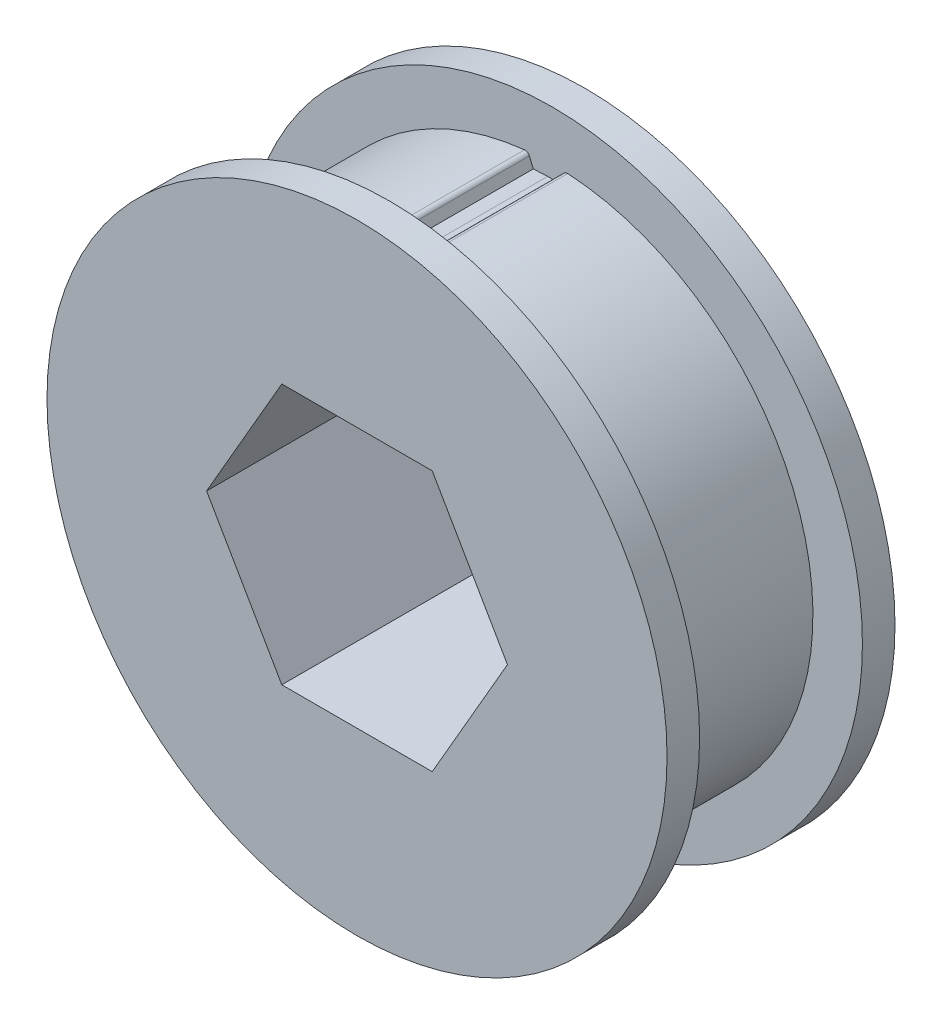
ISO-10303-21;
HEADER;
FILE_DESCRIPTION(('STEP AP214'),'2;1');
FILE_NAME('part.step','',(''),(''),'','','');
FILE_SCHEMA(('AUTOMOTIVE_DESIGN { 1 0 10303 214 1 1 1 1 }'));
ENDSEC;
DATA;
#1=APPLICATION_CONTEXT('core data for automotive mechanical design processes');
#2=APPLICATION_PROTOCOL_DEFINITION('international standard','automotive_design',2000,#1);
#3=PRODUCT_CONTEXT('',#1,'mechanical');
#4=PRODUCT('Part','Part','',(#3));
#5=PRODUCT_RELATED_PRODUCT_CATEGORY('part','',(#4));
#6=PRODUCT_DEFINITION_FORMATION('','',#4);
#7=PRODUCT_DEFINITION_CONTEXT('part definition',#1,'design');
#8=PRODUCT_DEFINITION('design','',#6,#7);
#9=PRODUCT_DEFINITION_SHAPE('','',#8);
#10=(LENGTH_UNIT() NAMED_UNIT(*) SI_UNIT(.MILLI.,.METRE.));
#11=(NAMED_UNIT(*) PLANE_ANGLE_UNIT() SI_UNIT($,.RADIAN.));
#12=(NAMED_UNIT(*) SI_UNIT($,.STERADIAN.) SOLID_ANGLE_UNIT());
#13=UNCERTAINTY_MEASURE_WITH_UNIT(LENGTH_MEASURE(1.E-05),#10,'distance_accuracy_value','');
#14=(GEOMETRIC_REPRESENTATION_CONTEXT(3) GLOBAL_UNCERTAINTY_ASSIGNED_CONTEXT((#13)) GLOBAL_UNIT_ASSIGNED_CONTEXT((#10,
#11,#12)) REPRESENTATION_CONTEXT('',''));
#15=CARTESIAN_POINT('',(0.,0.,0.));
#16=DIRECTION('',(0.,0.,1.));
#17=DIRECTION('',(1.,0.,0.));
#18=AXIS2_PLACEMENT_3D('',#15,#16,#17);
#19=CARTESIAN_POINT('',(-0.931743079196424,12.0340373689333,3.96875));
#20=DIRECTION('',(0.0483133795255113,-0.998832226832326,0.));
#21=DIRECTION('',(0.998832226832326,0.0483133795255113,0.));
#22=AXIS2_PLACEMENT_3D('',#19,#20,#21);
#23=PLANE('',#22);
#24=CARTESIAN_POINT('',(-0.931743079196695,12.0340373689332,-3.96875));
#25=DIRECTION('',(0.998832226832326,0.0483133795255112,0.));
#26=VECTOR('',#25,1.);
#27=LINE('',#24,#26);
#28=CARTESIAN_POINT('',(-0.931743079196693,12.0340373689332,-3.96875));
#29=VERTEX_POINT('',#28);
#30=CARTESIAN_POINT('',(-0.234855563582474,12.066372061651,-3.96875));
#31=VERTEX_POINT('',#30);
#32=EDGE_CURVE('E96',#29,#31,#27,.T.);
#33=ORIENTED_EDGE('',*,*,#32,.F.);
#34=DIRECTION('',(0.,0.,1.));
#35=VECTOR('',#34,1.);
#36=CARTESIAN_POINT('',(-0.931743079196691,12.0340373689331,3.96875));
#37=LINE('',#36,#35);
#38=CARTESIAN_POINT('',(-0.93174307919649,12.0340373689332,3.96875));
#39=VERTEX_POINT('',#38);
#40=EDGE_CURVE('E155',#29,#39,#37,.T.);
#41=ORIENTED_EDGE('',*,*,#40,.T.);
#42=CARTESIAN_POINT('',(-0.234888649719274,12.0677441233019,3.96875));
#43=DIRECTION('',(-0.998832226832326,-0.0483133795255102,0.));
#44=VECTOR('',#43,1.);
#45=LINE('',#42,#44);
#46=CARTESIAN_POINT('',(-0.234855563582474,12.066372061651,3.96875));
#47=VERTEX_POINT('',#46);
#48=EDGE_CURVE('E163',#47,#39,#45,.T.);
#49=ORIENTED_EDGE('',*,*,#48,.F.);
#50=CARTESIAN_POINT('',(-0.234888649719274,12.0677441233019,3.96875));
#51=DIRECTION('',(0.,0.,-1.));
#52=VECTOR('',#51,1.);
#53=LINE('',#50,#52);
#54=EDGE_CURVE('E153',#47,#31,#53,.T.);
#55=ORIENTED_EDGE('',*,*,#54,.T.);
#56=EDGE_LOOP('',(#33,#41,#49,#55));
#57=FACE_BOUND('',#56,.T.);
#58=ADVANCED_FACE('F34',(#57),#23,.F.);
#59=CARTESIAN_POINT('',(-0.34925,12.065,3.96875));
#60=DIRECTION('',(0.,-1.,0.));
#61=DIRECTION('',(0.,0.,-1.));
#62=AXIS2_PLACEMENT_3D('',#59,#60,#61);
#63=PLANE('',#62);
#64=DIRECTION('',(1.,0.,0.));
#65=VECTOR('',#64,1.);
#66=CARTESIAN_POINT('',(0.,12.065,-3.96875));
#67=LINE('',#66,#65);
#68=CARTESIAN_POINT('',(0.34925,12.065,-3.96875));
#69=VERTEX_POINT('',#68);
#70=EDGE_CURVE('E86',#31,#69,#67,.T.);
#71=ORIENTED_EDGE('',*,*,#70,.F.);
#72=ORIENTED_EDGE('',*,*,#54,.F.);
#73=CARTESIAN_POINT('',(0.34925,12.065,3.96875));
#74=DIRECTION('',(-1.,0.,0.));
#75=VECTOR('',#74,1.);
#76=LINE('',#73,#75);
#77=CARTESIAN_POINT('',(0.34925,12.065,3.96875));
#78=VERTEX_POINT('',#77);
#79=EDGE_CURVE('E157',#78,#47,#76,.T.);
#80=ORIENTED_EDGE('',*,*,#79,.F.);
#81=DIRECTION('',(0.,0.,1.));
#82=VECTOR('',#81,1.);
#83=CARTESIAN_POINT('',(0.34925,12.065,3.96875));
#84=LINE('',#83,#82);
#85=EDGE_CURVE('E203',#78,#69,#84,.F.);
#86=ORIENTED_EDGE('',*,*,#85,.T.);
#87=EDGE_LOOP('',(#71,#72,#80,#86));
#88=FACE_BOUND('',#87,.T.);
#89=ADVANCED_FACE('F220',(#88),#63,.F.);
#90=CARTESIAN_POINT('',(-1.12245413758304,12.4884039326647,3.96875));
#91=DIRECTION('',(-0.922071123967641,-0.387020467604817,0.));
#92=DIRECTION('',(0.387020467604817,-0.922071123967641,0.));
#93=AXIS2_PLACEMENT_3D('',#90,#91,#92);
#94=PLANE('',#93);
#95=DIRECTION('',(0.387020467604817,-0.922071123967641,0.));
#96=VECTOR('',#95,1.);
#97=CARTESIAN_POINT('',(-1.12245413758304,12.4884039326647,-3.96875));
#98=LINE('',#97,#96);
#99=CARTESIAN_POINT('',(-1.12245413758306,12.4884039326652,-3.96875));
#100=VERTEX_POINT('',#99);
#101=EDGE_CURVE('E152',#100,#29,#98,.T.);
#102=ORIENTED_EDGE('',*,*,#101,.F.);
#103=DIRECTION('',(0.,0.,1.));
#104=VECTOR('',#103,1.);
#105=CARTESIAN_POINT('',(-1.12245413758268,12.4884039326648,3.96875));
#106=LINE('',#105,#104);
#107=CARTESIAN_POINT('',(-1.12245413758309,12.4884039326653,3.96875));
#108=VERTEX_POINT('',#107);
#109=EDGE_CURVE('E145',#108,#100,#106,.F.);
#110=ORIENTED_EDGE('',*,*,#109,.F.);
#111=DIRECTION('',(0.387020467605358,-0.922071123967414,0.));
#112=VECTOR('',#111,1.);
#113=CARTESIAN_POINT('',(-1.12245413758304,12.4884039326647,3.96875));
#114=LINE('',#113,#112);
#115=EDGE_CURVE('E147',#108,#39,#114,.T.);
#116=ORIENTED_EDGE('',*,*,#115,.T.);
#117=ORIENTED_EDGE('',*,*,#40,.F.);
#118=EDGE_LOOP('',(#102,#110,#116,#117));
#119=FACE_BOUND('',#118,.T.);
#120=ADVANCED_FACE('F229',(#119),#94,.F.);
#121=CARTESIAN_POINT('',(0.34925,12.065,3.96875));
#122=DIRECTION('',(0.939692620785897,-0.342020143325699,0.));
#123=DIRECTION('',(0.342020143325699,0.939692620785897,0.));
#124=AXIS2_PLACEMENT_3D('',#121,#122,#123);
#125=PLANE('',#124);
#126=DIRECTION('',(0.342020143325699,0.939692620785897,0.));
#127=VECTOR('',#126,1.);
#128=CARTESIAN_POINT('',(0.34925,12.065,-3.96875));
#129=LINE('',#128,#127);
#130=CARTESIAN_POINT('',(0.517786366892735,12.5280498623951,-3.96875));
#131=VERTEX_POINT('',#130);
#132=EDGE_CURVE('E151',#69,#131,#129,.T.);
#133=ORIENTED_EDGE('',*,*,#132,.F.);
#134=ORIENTED_EDGE('',*,*,#85,.F.);
#135=DIRECTION('',(0.342020143325328,0.939692620786032,0.));
#136=VECTOR('',#135,1.);
#137=CARTESIAN_POINT('',(0.34925,12.065,3.96875));
#138=LINE('',#137,#136);
#139=CARTESIAN_POINT('',(0.517786366892628,12.5280498623951,3.96875));
#140=VERTEX_POINT('',#139);
#141=EDGE_CURVE('E150',#78,#140,#138,.T.);
#142=ORIENTED_EDGE('',*,*,#141,.T.);
#143=DIRECTION('',(0.,0.,1.));
#144=VECTOR('',#143,1.);
#145=CARTESIAN_POINT('',(0.517786366892455,12.5280498623948,3.96875));
#146=LINE('',#145,#144);
#147=EDGE_CURVE('E109',#131,#140,#146,.T.);
#148=ORIENTED_EDGE('',*,*,#147,.F.);
#149=EDGE_LOOP('',(#133,#134,#142,#148));
#150=FACE_BOUND('',#149,.T.);
#151=ADVANCED_FACE('F395',(#150),#125,.F.);
#152=CARTESIAN_POINT('',(0.,0.,-6.111875));
#153=DIRECTION('',(0.,0.,1.));
#154=DIRECTION('',(1.,0.,0.));
#155=AXIS2_PLACEMENT_3D('',#152,#153,#154);
#156=CYLINDRICAL_SURFACE('',#155,15.113);
#157=CARTESIAN_POINT('',(0.,0.,5.55625));
#158=DIRECTION('',(0.,0.,1.));
#159=DIRECTION('',(1.,0.,0.));
#160=AXIS2_PLACEMENT_3D('',#157,#158,#159);
#161=CIRCLE('',#160,15.113);
#162=CARTESIAN_POINT('',(15.113,0.,5.55625));
#163=VERTEX_POINT('',#162);
#164=EDGE_CURVE('E120',#163,#163,#161,.T.);
#165=ORIENTED_EDGE('',*,*,#164,.F.);
#166=EDGE_LOOP('',(#165));
#167=FACE_BOUND('',#166,.T.);
#168=CARTESIAN_POINT('',(0.,0.,3.96875));
#169=DIRECTION('',(0.,0.,1.));
#170=DIRECTION('',(1.,0.,0.));
#171=AXIS2_PLACEMENT_3D('',#168,#169,#170);
#172=CIRCLE('',#171,15.113);
#173=CARTESIAN_POINT('',(15.113,0.,3.96875));
#174=VERTEX_POINT('',#173);
#175=EDGE_CURVE('E148',#174,#174,#172,.T.);
#176=ORIENTED_EDGE('',*,*,#175,.T.);
#177=EDGE_LOOP('',(#176));
#178=FACE_BOUND('',#177,.T.);
#179=ADVANCED_FACE('F256',(#167,#178),#156,.T.);
#180=CARTESIAN_POINT('',(0.,0.,3.96875));
#181=DIRECTION('',(0.,0.,1.));
#182=DIRECTION('',(1.,0.,0.));
#183=AXIS2_PLACEMENT_3D('',#180,#181,#182);
#184=PLANE('',#183);
#185=CARTESIAN_POINT('',(-1.33323959652208,12.3999310537713,3.96875));
#186=DIRECTION('',(0.,0.,1.));
#187=DIRECTION('',(1.,0.,0.));
#188=AXIS2_PLACEMENT_3D('',#185,#186,#187);
#189=CIRCLE('',#188,0.2286);
#190=CARTESIAN_POINT('',(-1.3576784337472,12.6272209638755,3.96875));
#191=VERTEX_POINT('',#190);
#192=EDGE_CURVE('E133',#191,#108,#189,.F.);
#193=ORIENTED_EDGE('',*,*,#192,.F.);
#194=CARTESIAN_POINT('',(0.,0.,3.96875));
#195=DIRECTION('',(0.,0.,1.));
#196=DIRECTION('',(1.,0.,0.));
#197=AXIS2_PLACEMENT_3D('',#194,#195,#196);
#198=CIRCLE('',#197,12.7);
#199=CARTESIAN_POINT('',(0.746028615075746,12.678069305123,3.96875));
#200=VERTEX_POINT('',#199);
#201=EDGE_CURVE('E125',#200,#191,#198,.F.);
#202=ORIENTED_EDGE('',*,*,#201,.F.);
#203=CARTESIAN_POINT('',(0.732600100004388,12.4498640576313,3.96875));
#204=DIRECTION('',(0.,0.,1.));
#205=DIRECTION('',(1.,0.,0.));
#206=AXIS2_PLACEMENT_3D('',#203,#204,#205);
#207=CIRCLE('',#206,0.2286);
#208=EDGE_CURVE('E112',#140,#200,#207,.F.);
#209=ORIENTED_EDGE('',*,*,#208,.F.);
#210=ORIENTED_EDGE('',*,*,#141,.F.);
#211=ORIENTED_EDGE('',*,*,#79,.T.);
#212=ORIENTED_EDGE('',*,*,#48,.T.);
#213=ORIENTED_EDGE('',*,*,#115,.F.);
#214=EDGE_LOOP('',(#193,#202,#209,#210,#211,#212,#213));
#215=FACE_BOUND('',#214,.T.);
#216=ORIENTED_EDGE('',*,*,#175,.F.);
#217=EDGE_LOOP('',(#216));
#218=FACE_BOUND('',#217,.T.);
#219=ADVANCED_FACE('F130',(#215,#218),#184,.F.);
#220=CARTESIAN_POINT('',(-1.33323959652208,12.3999310537713,3.96875));
#221=DIRECTION('',(0.,0.,1.));
#222=DIRECTION('',(1.,0.,0.));
#223=AXIS2_PLACEMENT_3D('',#220,#221,#222);
#224=CYLINDRICAL_SURFACE('',#223,0.2286);
#225=CARTESIAN_POINT('',(-1.33323959652208,12.3999310537713,-3.96875));
#226=DIRECTION('',(0.,0.,1.));
#227=DIRECTION('',(1.,0.,0.));
#228=AXIS2_PLACEMENT_3D('',#225,#226,#227);
#229=CIRCLE('',#228,0.2286);
#230=CARTESIAN_POINT('',(-1.35767843374724,12.6272209638758,-3.96875));
#231=VERTEX_POINT('',#230);
#232=EDGE_CURVE('E143',#100,#231,#229,.T.);
#233=ORIENTED_EDGE('',*,*,#232,.T.);
#234=DIRECTION('',(0.,0.,1.));
#235=VECTOR('',#234,1.);
#236=CARTESIAN_POINT('',(-1.35767907062882,12.627220895398,-6.111875));
#237=LINE('',#236,#235);
#238=EDGE_CURVE('E128',#191,#231,#237,.F.);
#239=ORIENTED_EDGE('',*,*,#238,.F.);
#240=ORIENTED_EDGE('',*,*,#192,.T.);
#241=ORIENTED_EDGE('',*,*,#109,.T.);
#242=EDGE_LOOP('',(#233,#239,#240,#241));
#243=FACE_BOUND('',#242,.T.);
#244=ADVANCED_FACE('F255',(#243),#224,.T.);
#245=CARTESIAN_POINT('',(0.732600100004388,12.4498640576313,3.96875));
#246=DIRECTION('',(0.,0.,1.));
#247=DIRECTION('',(1.,0.,0.));
#248=AXIS2_PLACEMENT_3D('',#245,#246,#247);
#249=CYLINDRICAL_SURFACE('',#248,0.2286);
#250=ORIENTED_EDGE('',*,*,#208,.T.);
#251=DIRECTION('',(0.,0.,1.));
#252=VECTOR('',#251,1.);
#253=CARTESIAN_POINT('',(0.746028615075742,12.6780693051225,-6.111875));
#254=LINE('',#253,#252);
#255=CARTESIAN_POINT('',(0.746028615075746,12.678069305123,-3.96875));
#256=VERTEX_POINT('',#255);
#257=EDGE_CURVE('E115',#256,#200,#254,.T.);
#258=ORIENTED_EDGE('',*,*,#257,.F.);
#259=CARTESIAN_POINT('',(0.732600100004388,12.4498640576313,-3.96875));
#260=DIRECTION('',(0.,0.,1.));
#261=DIRECTION('',(1.,0.,0.));
#262=AXIS2_PLACEMENT_3D('',#259,#260,#261);
#263=CIRCLE('',#262,0.2286);
#264=EDGE_CURVE('E60',#256,#131,#263,.T.);
#265=ORIENTED_EDGE('',*,*,#264,.T.);
#266=ORIENTED_EDGE('',*,*,#147,.T.);
#267=EDGE_LOOP('',(#250,#258,#265,#266));
#268=FACE_BOUND('',#267,.T.);
#269=ADVANCED_FACE('F114',(#268),#249,.T.);
#270=CARTESIAN_POINT('',(0.,0.,5.55625));
#271=DIRECTION('',(0.,0.,1.));
#272=DIRECTION('',(1.,0.,0.));
#273=AXIS2_PLACEMENT_3D('',#270,#271,#272);
#274=PLANE('',#273);
#275=ORIENTED_EDGE('',*,*,#164,.T.);
#276=EDGE_LOOP('',(#275));
#277=FACE_BOUND('',#276,.T.);
#278=DIRECTION('',(-0.5,0.866025403784438,0.));
#279=VECTOR('',#278,1.);
#280=CARTESIAN_POINT('',(7.33234841870825,0.,5.55625));
#281=LINE('',#280,#279);
#282=CARTESIAN_POINT('',(7.33234841870825,0.,5.55625));
#283=VERTEX_POINT('',#282);
#284=CARTESIAN_POINT('',(3.66617420935412,6.35,5.55625));
#285=VERTEX_POINT('',#284);
#286=EDGE_CURVE('E366',#283,#285,#281,.T.);
#287=ORIENTED_EDGE('',*,*,#286,.F.);
#288=DIRECTION('',(0.499999999999999,0.866025403784439,0.));
#289=VECTOR('',#288,1.);
#290=CARTESIAN_POINT('',(3.66617420935413,-6.35,5.55625));
#291=LINE('',#290,#289);
#292=CARTESIAN_POINT('',(3.66617420935413,-6.35,5.55625));
#293=VERTEX_POINT('',#292);
#294=EDGE_CURVE('E180',#293,#283,#291,.T.);
#295=ORIENTED_EDGE('',*,*,#294,.F.);
#296=DIRECTION('',(1.,0.,0.));
#297=VECTOR('',#296,1.);
#298=CARTESIAN_POINT('',(-3.66617420935412,-6.35,5.55625));
#299=LINE('',#298,#297);
#300=CARTESIAN_POINT('',(-3.66617420935412,-6.35,5.55625));
#301=VERTEX_POINT('',#300);
#302=EDGE_CURVE('E352',#301,#293,#299,.T.);
#303=ORIENTED_EDGE('',*,*,#302,.F.);
#304=DIRECTION('',(0.5,-0.866025403784438,0.));
#305=VECTOR('',#304,1.);
#306=CARTESIAN_POINT('',(-7.33234841870824,0.,5.55625));
#307=LINE('',#306,#305);
#308=CARTESIAN_POINT('',(-7.33234841870824,0.,5.55625));
#309=VERTEX_POINT('',#308);
#310=EDGE_CURVE('E356',#309,#301,#307,.T.);
#311=ORIENTED_EDGE('',*,*,#310,.F.);
#312=DIRECTION('',(-0.499999999999999,-0.866025403784439,0.));
#313=VECTOR('',#312,1.);
#314=CARTESIAN_POINT('',(-3.66617420935412,6.35,5.55625));
#315=LINE('',#314,#313);
#316=CARTESIAN_POINT('',(-3.66617420935412,6.35,5.55625));
#317=VERTEX_POINT('',#316);
#318=EDGE_CURVE('E358',#317,#309,#315,.T.);
#319=ORIENTED_EDGE('',*,*,#318,.F.);
#320=DIRECTION('',(-1.,0.,0.));
#321=VECTOR('',#320,1.);
#322=CARTESIAN_POINT('',(3.66617420935412,6.35,5.55625));
#323=LINE('',#322,#321);
#324=EDGE_CURVE('E363',#285,#317,#323,.T.);
#325=ORIENTED_EDGE('',*,*,#324,.F.);
#326=EDGE_LOOP('',(#287,#295,#303,#311,#319,#325));
#327=FACE_BOUND('',#326,.T.);
#328=ADVANCED_FACE('F302',(#277,#327),#274,.T.);
#329=CARTESIAN_POINT('',(0.,0.,-6.111875));
#330=DIRECTION('',(0.,0.,1.));
#331=DIRECTION('',(1.,0.,0.));
#332=AXIS2_PLACEMENT_3D('',#329,#330,#331);
#333=CYLINDRICAL_SURFACE('',#332,12.7);
#334=CARTESIAN_POINT('',(0.,0.,-3.96875));
#335=DIRECTION('',(0.,0.,1.));
#336=DIRECTION('',(1.,0.,0.));
#337=AXIS2_PLACEMENT_3D('',#334,#335,#336);
#338=CIRCLE('',#337,12.7);
#339=EDGE_CURVE('E127',#256,#231,#338,.F.);
#340=ORIENTED_EDGE('',*,*,#339,.F.);
#341=ORIENTED_EDGE('',*,*,#257,.T.);
#342=ORIENTED_EDGE('',*,*,#201,.T.);
#343=ORIENTED_EDGE('',*,*,#238,.T.);
#344=EDGE_LOOP('',(#340,#341,#342,#343));
#345=FACE_BOUND('',#344,.T.);
#346=ADVANCED_FACE('F123',(#345),#333,.T.);
#347=CARTESIAN_POINT('',(0.,0.,-3.96875));
#348=DIRECTION('',(0.,0.,1.));
#349=DIRECTION('',(1.,0.,0.));
#350=AXIS2_PLACEMENT_3D('',#347,#348,#349);
#351=PLANE('',#350);
#352=ORIENTED_EDGE('',*,*,#264,.F.);
#353=ORIENTED_EDGE('',*,*,#339,.T.);
#354=ORIENTED_EDGE('',*,*,#232,.F.);
#355=ORIENTED_EDGE('',*,*,#101,.T.);
#356=ORIENTED_EDGE('',*,*,#32,.T.);
#357=ORIENTED_EDGE('',*,*,#70,.T.);
#358=ORIENTED_EDGE('',*,*,#132,.T.);
#359=EDGE_LOOP('',(#352,#353,#354,#355,#356,#357,#358));
#360=FACE_BOUND('',#359,.T.);
#361=CARTESIAN_POINT('',(0.,0.,-3.96875));
#362=DIRECTION('',(0.,0.,1.));
#363=DIRECTION('',(1.,0.,0.));
#364=AXIS2_PLACEMENT_3D('',#361,#362,#363);
#365=CIRCLE('',#364,15.113);
#366=CARTESIAN_POINT('',(15.113,0.,-3.96875));
#367=VERTEX_POINT('',#366);
#368=EDGE_CURVE('E43',#367,#367,#365,.F.);
#369=ORIENTED_EDGE('',*,*,#368,.F.);
#370=EDGE_LOOP('',(#369));
#371=FACE_BOUND('',#370,.T.);
#372=ADVANCED_FACE('F272',(#360,#371),#351,.T.);
#373=CARTESIAN_POINT('',(0.,0.,-6.111875));
#374=DIRECTION('',(0.,0.,1.));
#375=DIRECTION('',(1.,0.,0.));
#376=AXIS2_PLACEMENT_3D('',#373,#374,#375);
#377=CYLINDRICAL_SURFACE('',#376,15.113);
#378=ORIENTED_EDGE('',*,*,#368,.T.);
#379=EDGE_LOOP('',(#378));
#380=FACE_BOUND('',#379,.T.);
#381=CARTESIAN_POINT('',(0.,0.,-5.55625));
#382=DIRECTION('',(0.,0.,1.));
#383=DIRECTION('',(1.,0.,0.));
#384=AXIS2_PLACEMENT_3D('',#381,#382,#383);
#385=CIRCLE('',#384,15.113);
#386=CARTESIAN_POINT('',(15.113,0.,-5.55625));
#387=VERTEX_POINT('',#386);
#388=EDGE_CURVE('E11',#387,#387,#385,.T.);
#389=ORIENTED_EDGE('',*,*,#388,.T.);
#390=EDGE_LOOP('',(#389));
#391=FACE_BOUND('',#390,.T.);
#392=ADVANCED_FACE('F298',(#380,#391),#377,.T.);
#393=CARTESIAN_POINT('',(0.,0.,-5.55625));
#394=DIRECTION('',(0.,0.,1.));
#395=DIRECTION('',(1.,0.,0.));
#396=AXIS2_PLACEMENT_3D('',#393,#394,#395);
#397=PLANE('',#396);
#398=DIRECTION('',(0.499999999999999,0.866025403784439,0.));
#399=VECTOR('',#398,1.);
#400=CARTESIAN_POINT('',(3.66617420935413,-6.35,-5.55625));
#401=LINE('',#400,#399);
#402=CARTESIAN_POINT('',(3.66617420935413,-6.35,-5.55625));
#403=VERTEX_POINT('',#402);
#404=CARTESIAN_POINT('',(7.33234841870825,0.,-5.55625));
#405=VERTEX_POINT('',#404);
#406=EDGE_CURVE('E192',#403,#405,#401,.T.);
#407=ORIENTED_EDGE('',*,*,#406,.T.);
#408=DIRECTION('',(-0.5,0.866025403784438,0.));
#409=VECTOR('',#408,1.);
#410=CARTESIAN_POINT('',(7.33234841870825,0.,-5.55625));
#411=LINE('',#410,#409);
#412=CARTESIAN_POINT('',(3.66617420935412,6.35,-5.55625));
#413=VERTEX_POINT('',#412);
#414=EDGE_CURVE('E351',#405,#413,#411,.T.);
#415=ORIENTED_EDGE('',*,*,#414,.T.);
#416=DIRECTION('',(-1.,0.,0.));
#417=VECTOR('',#416,1.);
#418=CARTESIAN_POINT('',(3.66617420935412,6.35,-5.55625));
#419=LINE('',#418,#417);
#420=CARTESIAN_POINT('',(-3.66617420935412,6.35,-5.55625));
#421=VERTEX_POINT('',#420);
#422=EDGE_CURVE('E354',#413,#421,#419,.T.);
#423=ORIENTED_EDGE('',*,*,#422,.T.);
#424=DIRECTION('',(-0.499999999999999,-0.866025403784439,0.));
#425=VECTOR('',#424,1.);
#426=CARTESIAN_POINT('',(-3.66617420935412,6.35,-5.55625));
#427=LINE('',#426,#425);
#428=CARTESIAN_POINT('',(-7.33234841870824,0.,-5.55625));
#429=VERTEX_POINT('',#428);
#430=EDGE_CURVE('E51',#421,#429,#427,.T.);
#431=ORIENTED_EDGE('',*,*,#430,.T.);
#432=DIRECTION('',(0.5,-0.866025403784438,0.));
#433=VECTOR('',#432,1.);
#434=CARTESIAN_POINT('',(-7.33234841870824,0.,-5.55625));
#435=LINE('',#434,#433);
#436=CARTESIAN_POINT('',(-3.66617420935412,-6.35,-5.55625));
#437=VERTEX_POINT('',#436);
#438=EDGE_CURVE('E372',#429,#437,#435,.T.);
#439=ORIENTED_EDGE('',*,*,#438,.T.);
#440=DIRECTION('',(1.,0.,0.));
#441=VECTOR('',#440,1.);
#442=CARTESIAN_POINT('',(-3.66617420935412,-6.35,-5.55625));
#443=LINE('',#442,#441);
#444=EDGE_CURVE('E369',#437,#403,#443,.T.);
#445=ORIENTED_EDGE('',*,*,#444,.T.);
#446=EDGE_LOOP('',(#407,#415,#423,#431,#439,#445));
#447=FACE_BOUND('',#446,.T.);
#448=ORIENTED_EDGE('',*,*,#388,.F.);
#449=EDGE_LOOP('',(#448));
#450=FACE_BOUND('',#449,.T.);
#451=ADVANCED_FACE('F309',(#447,#450),#397,.F.);
#452=CARTESIAN_POINT('',(7.33234841870825,0.,-5.55625));
#453=DIRECTION('',(0.866025403784438,0.5,0.));
#454=DIRECTION('',(-0.5,0.866025403784439,0.));
#455=AXIS2_PLACEMENT_3D('',#452,#453,#454);
#456=PLANE('',#455);
#457=ORIENTED_EDGE('',*,*,#286,.T.);
#458=DIRECTION('',(0.,0.,1.));
#459=VECTOR('',#458,1.);
#460=CARTESIAN_POINT('',(3.66617420935412,6.35,-5.55625));
#461=LINE('',#460,#459);
#462=EDGE_CURVE('E190',#413,#285,#461,.T.);
#463=ORIENTED_EDGE('',*,*,#462,.F.);
#464=ORIENTED_EDGE('',*,*,#414,.F.);
#465=DIRECTION('',(0.,0.,1.));
#466=VECTOR('',#465,1.);
#467=CARTESIAN_POINT('',(7.33234841870825,0.,-5.55625));
#468=LINE('',#467,#466);
#469=EDGE_CURVE('E165',#405,#283,#468,.T.);
#470=ORIENTED_EDGE('',*,*,#469,.T.);
#471=EDGE_LOOP('',(#457,#463,#464,#470));
#472=FACE_BOUND('',#471,.T.);
#473=ADVANCED_FACE('F311',(#472),#456,.F.);
#474=CARTESIAN_POINT('',(3.66617420935413,-6.35,-5.55625));
#475=DIRECTION('',(0.866025403784439,-0.499999999999999,0.));
#476=DIRECTION('',(0.5,0.866025403784439,0.));
#477=AXIS2_PLACEMENT_3D('',#474,#475,#476);
#478=PLANE('',#477);
#479=ORIENTED_EDGE('',*,*,#294,.T.);
#480=ORIENTED_EDGE('',*,*,#469,.F.);
#481=ORIENTED_EDGE('',*,*,#406,.F.);
#482=DIRECTION('',(0.,0.,1.));
#483=VECTOR('',#482,1.);
#484=CARTESIAN_POINT('',(3.66617420935413,-6.35,-5.55625));
#485=LINE('',#484,#483);
#486=EDGE_CURVE('E168',#403,#293,#485,.T.);
#487=ORIENTED_EDGE('',*,*,#486,.T.);
#488=EDGE_LOOP('',(#479,#480,#481,#487));
#489=FACE_BOUND('',#488,.T.);
#490=ADVANCED_FACE('F317',(#489),#478,.F.);
#491=CARTESIAN_POINT('',(-3.66617420935412,-6.35,-5.55625));
#492=DIRECTION('',(0.,-1.,0.));
#493=DIRECTION('',(1.,0.,0.));
#494=AXIS2_PLACEMENT_3D('',#491,#492,#493);
#495=PLANE('',#494);
#496=ORIENTED_EDGE('',*,*,#302,.T.);
#497=ORIENTED_EDGE('',*,*,#486,.F.);
#498=ORIENTED_EDGE('',*,*,#444,.F.);
#499=DIRECTION('',(0.,0.,1.));
#500=VECTOR('',#499,1.);
#501=CARTESIAN_POINT('',(-3.66617420935412,-6.35,-5.55625));
#502=LINE('',#501,#500);
#503=EDGE_CURVE('E177',#437,#301,#502,.T.);
#504=ORIENTED_EDGE('',*,*,#503,.T.);
#505=EDGE_LOOP('',(#496,#497,#498,#504));
#506=FACE_BOUND('',#505,.T.);
#507=ADVANCED_FACE('F332',(#506),#495,.F.);
#508=CARTESIAN_POINT('',(-7.33234841870824,0.,-5.55625));
#509=DIRECTION('',(-0.866025403784438,-0.5,0.));
#510=DIRECTION('',(0.5,-0.866025403784438,0.));
#511=AXIS2_PLACEMENT_3D('',#508,#509,#510);
#512=PLANE('',#511);
#513=ORIENTED_EDGE('',*,*,#310,.T.);
#514=ORIENTED_EDGE('',*,*,#503,.F.);
#515=ORIENTED_EDGE('',*,*,#438,.F.);
#516=DIRECTION('',(0.,0.,1.));
#517=VECTOR('',#516,1.);
#518=CARTESIAN_POINT('',(-7.33234841870824,0.,-5.55625));
#519=LINE('',#518,#517);
#520=EDGE_CURVE('E185',#429,#309,#519,.T.);
#521=ORIENTED_EDGE('',*,*,#520,.T.);
#522=EDGE_LOOP('',(#513,#514,#515,#521));
#523=FACE_BOUND('',#522,.T.);
#524=ADVANCED_FACE('F329',(#523),#512,.F.);
#525=CARTESIAN_POINT('',(-3.66617420935412,6.35,-5.55625));
#526=DIRECTION('',(-0.866025403784439,0.499999999999999,0.));
#527=DIRECTION('',(-0.499999999999999,-0.866025403784439,0.));
#528=AXIS2_PLACEMENT_3D('',#525,#526,#527);
#529=PLANE('',#528);
#530=ORIENTED_EDGE('',*,*,#318,.T.);
#531=ORIENTED_EDGE('',*,*,#520,.F.);
#532=ORIENTED_EDGE('',*,*,#430,.F.);
#533=DIRECTION('',(0.,0.,1.));
#534=VECTOR('',#533,1.);
#535=CARTESIAN_POINT('',(-3.66617420935412,6.35,-5.55625));
#536=LINE('',#535,#534);
#537=EDGE_CURVE('E188',#421,#317,#536,.T.);
#538=ORIENTED_EDGE('',*,*,#537,.T.);
#539=EDGE_LOOP('',(#530,#531,#532,#538));
#540=FACE_BOUND('',#539,.T.);
#541=ADVANCED_FACE('F325',(#540),#529,.F.);
#542=CARTESIAN_POINT('',(3.66617420935412,6.35,-5.55625));
#543=DIRECTION('',(0.,1.,0.));
#544=DIRECTION('',(-1.,0.,0.));
#545=AXIS2_PLACEMENT_3D('',#542,#543,#544);
#546=PLANE('',#545);
#547=ORIENTED_EDGE('',*,*,#324,.T.);
#548=ORIENTED_EDGE('',*,*,#537,.F.);
#549=ORIENTED_EDGE('',*,*,#422,.F.);
#550=ORIENTED_EDGE('',*,*,#462,.T.);
#551=EDGE_LOOP('',(#547,#548,#549,#550));
#552=FACE_BOUND('',#551,.T.);
#553=ADVANCED_FACE('F322',(#552),#546,.F.);
#554=CLOSED_SHELL('',(#58,#89,#120,#151,#179,#219,#244,#269,#328,#346,#372,#392,#451,#473,#490,
#507,#524,#541,#553));
#555=MANIFOLD_SOLID_BREP('B2',#554);
#556=ADVANCED_BREP_SHAPE_REPRESENTATION('',(#18,#555),#14);
#557=SHAPE_DEFINITION_REPRESENTATION(#9,#556);
ENDSEC;
END-ISO-10303-21;
